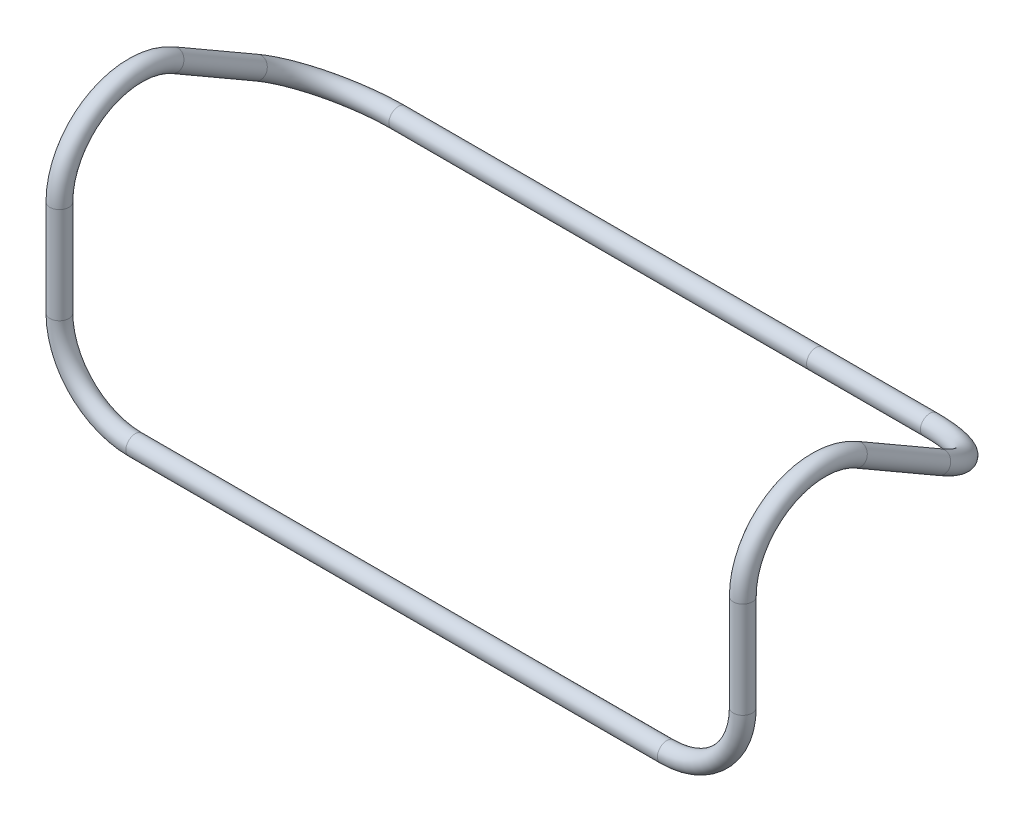
ISO-10303-21;
HEADER;
FILE_DESCRIPTION(('STEP AP214'),'2;1');
FILE_NAME('part.step','',(''),(''),'','','');
FILE_SCHEMA(('AUTOMOTIVE_DESIGN { 1 0 10303 214 1 1 1 1 }'));
ENDSEC;
DATA;
#1=APPLICATION_CONTEXT('core data for automotive mechanical design processes');
#2=APPLICATION_PROTOCOL_DEFINITION('international standard','automotive_design',2000,#1);
#3=PRODUCT_CONTEXT('',#1,'mechanical');
#4=PRODUCT('Part','Part','',(#3));
#5=PRODUCT_RELATED_PRODUCT_CATEGORY('part','',(#4));
#6=PRODUCT_DEFINITION_FORMATION('','',#4);
#7=PRODUCT_DEFINITION_CONTEXT('part definition',#1,'design');
#8=PRODUCT_DEFINITION('design','',#6,#7);
#9=PRODUCT_DEFINITION_SHAPE('','',#8);
#10=(LENGTH_UNIT() NAMED_UNIT(*) SI_UNIT(.MILLI.,.METRE.));
#11=(NAMED_UNIT(*) PLANE_ANGLE_UNIT() SI_UNIT($,.RADIAN.));
#12=(NAMED_UNIT(*) SI_UNIT($,.STERADIAN.) SOLID_ANGLE_UNIT());
#13=UNCERTAINTY_MEASURE_WITH_UNIT(LENGTH_MEASURE(1.E-05),#10,'distance_accuracy_value','');
#14=(GEOMETRIC_REPRESENTATION_CONTEXT(3) GLOBAL_UNCERTAINTY_ASSIGNED_CONTEXT((#13)) GLOBAL_UNIT_ASSIGNED_CONTEXT((#10,
#11,#12)) REPRESENTATION_CONTEXT('',''));
#15=CARTESIAN_POINT('',(0.,0.,0.));
#16=DIRECTION('',(0.,0.,1.));
#17=DIRECTION('',(1.,0.,0.));
#18=AXIS2_PLACEMENT_3D('',#15,#16,#17);
#19=CARTESIAN_POINT('',(-50.,39.9999999999996,-69.2820323027548));
#20=DIRECTION('',(-1.,0.,0.));
#21=DIRECTION('',(0.,0.,1.));
#22=AXIS2_PLACEMENT_3D('',#19,#20,#21);
#23=CYLINDRICAL_SURFACE('',#22,2.5);
#24=CARTESIAN_POINT('',(-160.,39.9999999999996,-69.2820323027547));
#25=DIRECTION('',(1.,0.,0.));
#26=DIRECTION('',(0.,0.,-1.));
#27=AXIS2_PLACEMENT_3D('',#24,#25,#26);
#28=CIRCLE('',#27,2.5);
#29=CARTESIAN_POINT('',(-160.,38.7499999999996,-71.4470958122157));
#30=VERTEX_POINT('',#29);
#31=EDGE_CURVE('E78',#30,#30,#28,.T.);
#32=ORIENTED_EDGE('',*,*,#31,.T.);
#33=EDGE_LOOP('',(#32));
#34=FACE_BOUND('',#33,.T.);
#35=CARTESIAN_POINT('',(-50.,39.9999999999996,-69.2820323027548));
#36=DIRECTION('',(1.,0.,0.));
#37=DIRECTION('',(0.,0.,-1.));
#38=AXIS2_PLACEMENT_3D('',#35,#36,#37);
#39=CIRCLE('',#38,2.5);
#40=CARTESIAN_POINT('',(-50.,39.9999999999996,-71.7820323027548));
#41=VERTEX_POINT('',#40);
#42=EDGE_CURVE('E81',#41,#41,#39,.T.);
#43=ORIENTED_EDGE('',*,*,#42,.F.);
#44=EDGE_LOOP('',(#43));
#45=FACE_BOUND('',#44,.T.);
#46=ADVANCED_FACE('F37',(#34,#45),#23,.T.);
#47=CARTESIAN_POINT('',(-160.,49.9999999999997,-51.961524227066));
#48=DIRECTION('',(0.,0.866025403784436,-0.500000000000005));
#49=DIRECTION('',(0.,0.500000000000005,0.866025403784436));
#50=AXIS2_PLACEMENT_3D('',#47,#48,#49);
#51=TOROIDAL_SURFACE('',#50,19.9999999999999,2.5);
#52=CARTESIAN_POINT('',(-180.,49.9999999999996,-51.9615242270661));
#53=DIRECTION('',(0.,-0.500000000000006,-0.866025403784435));
#54=DIRECTION('',(-0.866025403784436,0.43301270189222,-0.250000000000009));
#55=AXIS2_PLACEMENT_3D('',#52,#53,#54);
#56=CIRCLE('',#55,2.5);
#57=CARTESIAN_POINT('',(-182.5,49.9999999999996,-51.9615242270661));
#58=VERTEX_POINT('',#57);
#59=EDGE_CURVE('E75',#58,#58,#56,.T.);
#60=CARTESIAN_POINT('',(-160.,49.9999999999997,-51.961524227066));
#61=DIRECTION('',(0.,0.866025403784436,-0.500000000000005));
#62=DIRECTION('',(0.,0.500000000000005,0.866025403784436));
#63=AXIS2_PLACEMENT_3D('',#60,#61,#62);
#64=CIRCLE('',#63,22.4999999999999);
#65=EDGE_CURVE('',#30,#58,#64,.T.);
#66=ORIENTED_EDGE('',*,*,#31,.F.);
#67=ORIENTED_EDGE('',*,*,#59,.T.);
#68=ORIENTED_EDGE('',*,*,#65,.T.);
#69=ORIENTED_EDGE('',*,*,#65,.F.);
#70=EDGE_LOOP('',(#66,#68,#67,#69));
#71=FACE_BOUND('',#70,.T.);
#72=ADVANCED_FACE('F88',(#71),#51,.T.);
#73=CARTESIAN_POINT('',(-180.,49.9999999999997,-51.9615242270661));
#74=DIRECTION('',(0.,0.500000000000006,0.866025403784435));
#75=DIRECTION('',(0.,-0.866025403784435,0.500000000000006));
#76=AXIS2_PLACEMENT_3D('',#73,#74,#75);
#77=CYLINDRICAL_SURFACE('',#76,2.5);
#78=CARTESIAN_POINT('',(-180.,62.6794919243109,-30.0000000000001));
#79=DIRECTION('',(0.,-0.500000000000006,-0.866025403784435));
#80=DIRECTION('',(-0.866025403784436,0.433012701892219,-0.250000000000011));
#81=AXIS2_PLACEMENT_3D('',#78,#79,#80);
#82=CIRCLE('',#81,2.5);
#83=CARTESIAN_POINT('',(-180.,64.844555433772,-31.2500000000001));
#84=VERTEX_POINT('',#83);
#85=EDGE_CURVE('E72',#84,#84,#82,.T.);
#86=ORIENTED_EDGE('',*,*,#85,.T.);
#87=EDGE_LOOP('',(#86));
#88=FACE_BOUND('',#87,.T.);
#89=ORIENTED_EDGE('',*,*,#59,.F.);
#90=EDGE_LOOP('',(#89));
#91=FACE_BOUND('',#90,.T.);
#92=ADVANCED_FACE('F94',(#88,#91),#77,.T.);
#93=CARTESIAN_POINT('',(-180.,45.3589838486222,-20.));
#94=DIRECTION('',(1.,0.,0.));
#95=DIRECTION('',(0.,0.,-1.));
#96=AXIS2_PLACEMENT_3D('',#93,#94,#95);
#97=TOROIDAL_SURFACE('',#96,20.,2.5);
#98=CARTESIAN_POINT('',(-180.,45.3589838486222,0.));
#99=DIRECTION('',(0.,1.,0.));
#100=DIRECTION('',(-0.866025403784439,0.,0.499999999999999));
#101=AXIS2_PLACEMENT_3D('',#98,#99,#100);
#102=CIRCLE('',#101,2.5);
#103=CARTESIAN_POINT('',(-180.,45.3589838486222,2.49999999999992));
#104=VERTEX_POINT('',#103);
#105=EDGE_CURVE('E69',#104,#104,#102,.T.);
#106=CARTESIAN_POINT('',(-180.,45.3589838486222,-20.));
#107=DIRECTION('',(1.,0.,0.));
#108=DIRECTION('',(0.,0.,-1.));
#109=AXIS2_PLACEMENT_3D('',#106,#107,#108);
#110=CIRCLE('',#109,22.4999999999999);
#111=EDGE_CURVE('',#84,#104,#110,.T.);
#112=ORIENTED_EDGE('',*,*,#85,.F.);
#113=ORIENTED_EDGE('',*,*,#105,.T.);
#114=ORIENTED_EDGE('',*,*,#111,.T.);
#115=ORIENTED_EDGE('',*,*,#111,.F.);
#116=EDGE_LOOP('',(#112,#114,#113,#115));
#117=FACE_BOUND('',#116,.T.);
#118=ADVANCED_FACE('F100',(#117),#97,.T.);
#119=CARTESIAN_POINT('',(-180.,45.3589838486222,0.));
#120=DIRECTION('',(0.,-1.,0.));
#121=DIRECTION('',(1.,0.,0.));
#122=AXIS2_PLACEMENT_3D('',#119,#120,#121);
#123=CYLINDRICAL_SURFACE('',#122,2.5);
#124=CARTESIAN_POINT('',(-180.,20.,0.));
#125=DIRECTION('',(0.,1.,0.));
#126=DIRECTION('',(-0.866025403784439,0.,0.499999999999999));
#127=AXIS2_PLACEMENT_3D('',#124,#125,#126);
#128=CIRCLE('',#127,2.5);
#129=CARTESIAN_POINT('',(-182.5,20.,0.));
#130=VERTEX_POINT('',#129);
#131=EDGE_CURVE('E66',#130,#130,#128,.T.);
#132=ORIENTED_EDGE('',*,*,#131,.T.);
#133=EDGE_LOOP('',(#132));
#134=FACE_BOUND('',#133,.T.);
#135=ORIENTED_EDGE('',*,*,#105,.F.);
#136=EDGE_LOOP('',(#135));
#137=FACE_BOUND('',#136,.T.);
#138=ADVANCED_FACE('F104',(#134,#137),#123,.T.);
#139=CARTESIAN_POINT('',(-160.,20.,0.));
#140=DIRECTION('',(0.,0.,1.));
#141=DIRECTION('',(0.,-1.,0.));
#142=AXIS2_PLACEMENT_3D('',#139,#140,#141);
#143=TOROIDAL_SURFACE('',#142,20.,2.5);
#144=CARTESIAN_POINT('',(-160.,0.,0.));
#145=DIRECTION('',(-1.,0.,0.));
#146=DIRECTION('',(0.,-0.866025403784435,0.500000000000006));
#147=AXIS2_PLACEMENT_3D('',#144,#145,#146);
#148=CIRCLE('',#147,2.5);
#149=CARTESIAN_POINT('',(-160.,-2.49999999999996,0.));
#150=VERTEX_POINT('',#149);
#151=EDGE_CURVE('E63',#150,#150,#148,.T.);
#152=CARTESIAN_POINT('',(-160.,20.,0.));
#153=DIRECTION('',(0.,0.,1.));
#154=DIRECTION('',(0.,-1.,0.));
#155=AXIS2_PLACEMENT_3D('',#152,#153,#154);
#156=CIRCLE('',#155,22.5);
#157=EDGE_CURVE('',#130,#150,#156,.T.);
#158=ORIENTED_EDGE('',*,*,#131,.F.);
#159=ORIENTED_EDGE('',*,*,#151,.T.);
#160=ORIENTED_EDGE('',*,*,#157,.T.);
#161=ORIENTED_EDGE('',*,*,#157,.F.);
#162=EDGE_LOOP('',(#158,#160,#159,#161));
#163=FACE_BOUND('',#162,.T.);
#164=ADVANCED_FACE('F108',(#163),#143,.T.);
#165=CARTESIAN_POINT('',(-160.,0.,0.));
#166=DIRECTION('',(1.,0.,0.));
#167=DIRECTION('',(0.,1.,0.));
#168=AXIS2_PLACEMENT_3D('',#165,#166,#167);
#169=CYLINDRICAL_SURFACE('',#168,2.5);
#170=CARTESIAN_POINT('',(-20.,0.,0.));
#171=DIRECTION('',(-1.,0.,0.));
#172=DIRECTION('',(0.,-0.866025403784435,0.500000000000006));
#173=AXIS2_PLACEMENT_3D('',#170,#171,#172);
#174=CIRCLE('',#173,2.5);
#175=CARTESIAN_POINT('',(-20.,-2.49999999999994,0.));
#176=VERTEX_POINT('',#175);
#177=EDGE_CURVE('E60',#176,#176,#174,.T.);
#178=ORIENTED_EDGE('',*,*,#177,.T.);
#179=EDGE_LOOP('',(#178));
#180=FACE_BOUND('',#179,.T.);
#181=ORIENTED_EDGE('',*,*,#151,.F.);
#182=EDGE_LOOP('',(#181));
#183=FACE_BOUND('',#182,.T.);
#184=ADVANCED_FACE('F112',(#180,#183),#169,.T.);
#185=CARTESIAN_POINT('',(-20.,20.,0.));
#186=DIRECTION('',(0.,0.,1.));
#187=DIRECTION('',(1.,0.,0.));
#188=AXIS2_PLACEMENT_3D('',#185,#186,#187);
#189=TOROIDAL_SURFACE('',#188,20.,2.5);
#190=CARTESIAN_POINT('',(0.,20.,0.));
#191=DIRECTION('',(0.,-1.,0.));
#192=DIRECTION('',(0.866025403784436,0.,0.500000000000005));
#193=AXIS2_PLACEMENT_3D('',#190,#191,#192);
#194=CIRCLE('',#193,2.5);
#195=CARTESIAN_POINT('',(2.49999999999995,20.,0.));
#196=VERTEX_POINT('',#195);
#197=EDGE_CURVE('E57',#196,#196,#194,.T.);
#198=CARTESIAN_POINT('',(-20.,20.,0.));
#199=DIRECTION('',(0.,0.,1.));
#200=DIRECTION('',(1.,0.,0.));
#201=AXIS2_PLACEMENT_3D('',#198,#199,#200);
#202=CIRCLE('',#201,22.4999999999999);
#203=EDGE_CURVE('',#176,#196,#202,.T.);
#204=ORIENTED_EDGE('',*,*,#177,.F.);
#205=ORIENTED_EDGE('',*,*,#197,.T.);
#206=ORIENTED_EDGE('',*,*,#203,.T.);
#207=ORIENTED_EDGE('',*,*,#203,.F.);
#208=EDGE_LOOP('',(#204,#206,#205,#207));
#209=FACE_BOUND('',#208,.T.);
#210=ADVANCED_FACE('F116',(#209),#189,.T.);
#211=CARTESIAN_POINT('',(0.,20.,0.));
#212=DIRECTION('',(0.,1.,0.));
#213=DIRECTION('',(-1.,0.,0.));
#214=AXIS2_PLACEMENT_3D('',#211,#212,#213);
#215=CYLINDRICAL_SURFACE('',#214,2.5);
#216=CARTESIAN_POINT('',(0.,45.3589838486222,0.));
#217=DIRECTION('',(0.,-1.,0.));
#218=DIRECTION('',(0.866025403784436,0.,0.500000000000005));
#219=AXIS2_PLACEMENT_3D('',#216,#217,#218);
#220=CIRCLE('',#219,2.5);
#221=CARTESIAN_POINT('',(0.,45.3589838486222,2.49999999999994));
#222=VERTEX_POINT('',#221);
#223=EDGE_CURVE('E52',#222,#222,#220,.T.);
#224=ORIENTED_EDGE('',*,*,#223,.T.);
#225=EDGE_LOOP('',(#224));
#226=FACE_BOUND('',#225,.T.);
#227=ORIENTED_EDGE('',*,*,#197,.F.);
#228=EDGE_LOOP('',(#227));
#229=FACE_BOUND('',#228,.T.);
#230=ADVANCED_FACE('F120',(#226,#229),#215,.T.);
#231=CARTESIAN_POINT('',(0.,45.3589838486222,-20.));
#232=DIRECTION('',(-1.,0.,0.));
#233=DIRECTION('',(0.,0.,1.));
#234=AXIS2_PLACEMENT_3D('',#231,#232,#233);
#235=TOROIDAL_SURFACE('',#234,19.9999999999999,2.5);
#236=CARTESIAN_POINT('',(0.,62.6794919243109,-30.0000000000001));
#237=DIRECTION('',(0.,0.500000000000004,0.866025403784436));
#238=DIRECTION('',(0.866025403784441,0.433012701892216,-0.249999999999997));
#239=AXIS2_PLACEMENT_3D('',#236,#237,#238);
#240=CIRCLE('',#239,2.5);
#241=CARTESIAN_POINT('',(0.,64.844555433772,-31.2500000000001));
#242=VERTEX_POINT('',#241);
#243=EDGE_CURVE('E48',#242,#242,#240,.T.);
#244=CARTESIAN_POINT('',(0.,45.3589838486222,-20.));
#245=DIRECTION('',(-1.,0.,0.));
#246=DIRECTION('',(0.,0.,1.));
#247=AXIS2_PLACEMENT_3D('',#244,#245,#246);
#248=CIRCLE('',#247,22.4999999999999);
#249=EDGE_CURVE('',#222,#242,#248,.T.);
#250=ORIENTED_EDGE('',*,*,#223,.F.);
#251=ORIENTED_EDGE('',*,*,#243,.T.);
#252=ORIENTED_EDGE('',*,*,#249,.T.);
#253=ORIENTED_EDGE('',*,*,#249,.F.);
#254=EDGE_LOOP('',(#250,#252,#251,#253));
#255=FACE_BOUND('',#254,.T.);
#256=ADVANCED_FACE('F124',(#255),#235,.T.);
#257=CARTESIAN_POINT('',(1.04083408558608E-13,62.6794919243109,-30.));
#258=DIRECTION('',(0.,-0.500000000000004,-0.866025403784437));
#259=DIRECTION('',(0.,0.866025403784437,-0.500000000000004));
#260=AXIS2_PLACEMENT_3D('',#257,#258,#259);
#261=CYLINDRICAL_SURFACE('',#260,2.5);
#262=CARTESIAN_POINT('',(1.87350135405495E-13,49.9999999999997,-51.9615242270661));
#263=DIRECTION('',(0.,0.500000000000003,0.866025403784437));
#264=DIRECTION('',(0.866025403784441,0.433012701892217,-0.249999999999997));
#265=AXIS2_PLACEMENT_3D('',#262,#263,#264);
#266=CIRCLE('',#265,2.5);
#267=CARTESIAN_POINT('',(2.50000000000018,49.9999999999997,-51.9615242270661));
#268=VERTEX_POINT('',#267);
#269=EDGE_CURVE('E44',#268,#268,#266,.T.);
#270=ORIENTED_EDGE('',*,*,#269,.T.);
#271=EDGE_LOOP('',(#270));
#272=FACE_BOUND('',#271,.T.);
#273=ORIENTED_EDGE('',*,*,#243,.F.);
#274=EDGE_LOOP('',(#273));
#275=FACE_BOUND('',#274,.T.);
#276=ADVANCED_FACE('F128',(#272,#275),#261,.T.);
#277=CARTESIAN_POINT('',(-19.9999999999998,49.9999999999997,-51.9615242270661));
#278=DIRECTION('',(0.,0.866025403784436,-0.500000000000004));
#279=DIRECTION('',(0.,0.500000000000004,0.866025403784437));
#280=AXIS2_PLACEMENT_3D('',#277,#278,#279);
#281=TOROIDAL_SURFACE('',#280,20.,2.5);
#282=CARTESIAN_POINT('',(-19.9999999999999,39.9999999999995,-69.2820323027548));
#283=DIRECTION('',(1.,0.,0.));
#284=DIRECTION('',(0.,0.,-1.));
#285=AXIS2_PLACEMENT_3D('',#282,#283,#284);
#286=CIRCLE('',#285,2.5);
#287=CARTESIAN_POINT('',(-19.9999999999999,38.7499999999996,-71.4470958122159));
#288=VERTEX_POINT('',#287);
#289=EDGE_CURVE('E10',#288,#288,#286,.T.);
#290=CARTESIAN_POINT('',(-19.9999999999998,49.9999999999997,-51.9615242270661));
#291=DIRECTION('',(0.,0.866025403784436,-0.500000000000004));
#292=DIRECTION('',(0.,0.500000000000004,0.866025403784437));
#293=AXIS2_PLACEMENT_3D('',#290,#291,#292);
#294=CIRCLE('',#293,22.4999999999999);
#295=EDGE_CURVE('',#268,#288,#294,.T.);
#296=ORIENTED_EDGE('',*,*,#269,.F.);
#297=ORIENTED_EDGE('',*,*,#289,.T.);
#298=ORIENTED_EDGE('',*,*,#295,.T.);
#299=ORIENTED_EDGE('',*,*,#295,.F.);
#300=EDGE_LOOP('',(#296,#298,#297,#299));
#301=FACE_BOUND('',#300,.T.);
#302=ADVANCED_FACE('F131',(#301),#281,.T.);
#303=CARTESIAN_POINT('',(-19.9999999999998,39.9999999999995,-69.2820323027549));
#304=DIRECTION('',(-1.,0.,0.));
#305=DIRECTION('',(0.,0.,1.));
#306=AXIS2_PLACEMENT_3D('',#303,#304,#305);
#307=CYLINDRICAL_SURFACE('',#306,2.5);
#308=ORIENTED_EDGE('',*,*,#42,.T.);
#309=EDGE_LOOP('',(#308));
#310=FACE_BOUND('',#309,.T.);
#311=ORIENTED_EDGE('',*,*,#289,.F.);
#312=EDGE_LOOP('',(#311));
#313=FACE_BOUND('',#312,.T.);
#314=ADVANCED_FACE('F39',(#310,#313),#307,.T.);
#315=CLOSED_SHELL('',(#46,#72,#92,#118,#138,#164,#184,#210,#230,#256,#276,#302,#314));
#316=MANIFOLD_SOLID_BREP('B2',#315);
#317=ADVANCED_BREP_SHAPE_REPRESENTATION('',(#18,#316),#14);
#318=SHAPE_DEFINITION_REPRESENTATION(#9,#317);
ENDSEC;
END-ISO-10303-21;
